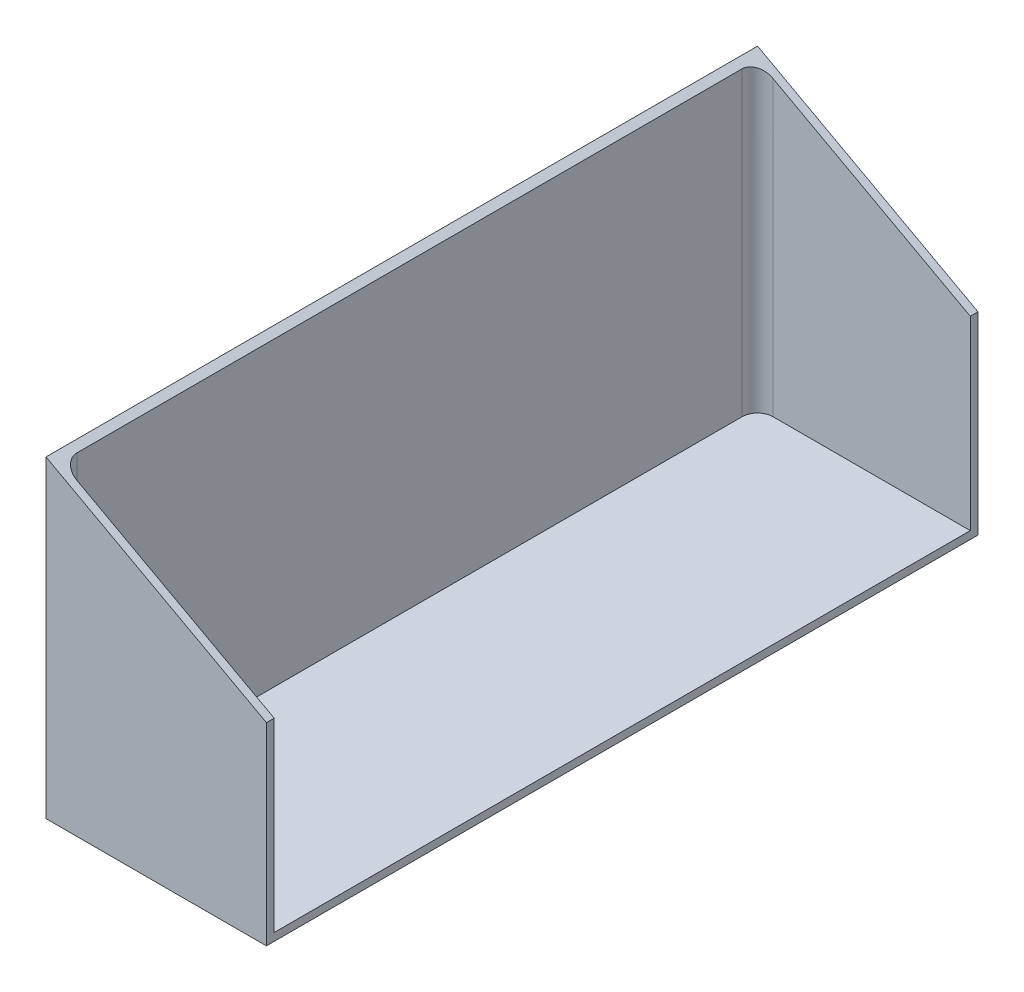
ISO-10303-21;
HEADER;
FILE_DESCRIPTION(('STEP AP214'),'2;1');
FILE_NAME('part.step','',(''),(''),'','','');
FILE_SCHEMA(('AUTOMOTIVE_DESIGN { 1 0 10303 214 1 1 1 1 }'));
ENDSEC;
DATA;
#1=APPLICATION_CONTEXT('core data for automotive mechanical design processes');
#2=APPLICATION_PROTOCOL_DEFINITION('international standard','automotive_design',2000,#1);
#3=PRODUCT_CONTEXT('',#1,'mechanical');
#4=PRODUCT('Part','Part','',(#3));
#5=PRODUCT_RELATED_PRODUCT_CATEGORY('part','',(#4));
#6=PRODUCT_DEFINITION_FORMATION('','',#4);
#7=PRODUCT_DEFINITION_CONTEXT('part definition',#1,'design');
#8=PRODUCT_DEFINITION('design','',#6,#7);
#9=PRODUCT_DEFINITION_SHAPE('','',#8);
#10=(LENGTH_UNIT() NAMED_UNIT(*) SI_UNIT(.MILLI.,.METRE.));
#11=(NAMED_UNIT(*) PLANE_ANGLE_UNIT() SI_UNIT($,.RADIAN.));
#12=(NAMED_UNIT(*) SI_UNIT($,.STERADIAN.) SOLID_ANGLE_UNIT());
#13=UNCERTAINTY_MEASURE_WITH_UNIT(LENGTH_MEASURE(1.E-05),#10,'distance_accuracy_value','');
#14=(GEOMETRIC_REPRESENTATION_CONTEXT(3) GLOBAL_UNCERTAINTY_ASSIGNED_CONTEXT((#13)) GLOBAL_UNIT_ASSIGNED_CONTEXT((#10,
#11,#12)) REPRESENTATION_CONTEXT('',''));
#15=CARTESIAN_POINT('',(0.,0.,0.));
#16=DIRECTION('',(0.,0.,1.));
#17=DIRECTION('',(1.,0.,0.));
#18=AXIS2_PLACEMENT_3D('',#15,#16,#17);
#19=CARTESIAN_POINT('',(0.,0.,-10.));
#20=DIRECTION('',(-1.,0.,0.));
#21=DIRECTION('',(0.,0.,1.));
#22=AXIS2_PLACEMENT_3D('',#19,#20,#21);
#23=PLANE('',#22);
#24=DIRECTION('',(0.,-1.,0.));
#25=VECTOR('',#24,1.);
#26=CARTESIAN_POINT('',(0.,0.,0.));
#27=LINE('',#26,#25);
#28=CARTESIAN_POINT('',(0.,405.,0.));
#29=VERTEX_POINT('',#28);
#30=CARTESIAN_POINT('',(0.,0.,0.));
#31=VERTEX_POINT('',#30);
#32=EDGE_CURVE('E160',#29,#31,#27,.T.);
#33=ORIENTED_EDGE('',*,*,#32,.F.);
#34=DIRECTION('',(0.,0.,1.));
#35=VECTOR('',#34,1.);
#36=CARTESIAN_POINT('',(0.,405.,-10.));
#37=LINE('',#36,#35);
#38=CARTESIAN_POINT('',(0.,405.,-920.));
#39=VERTEX_POINT('',#38);
#40=EDGE_CURVE('E175',#39,#29,#37,.T.);
#41=ORIENTED_EDGE('',*,*,#40,.F.);
#42=DIRECTION('',(0.,-1.,0.));
#43=VECTOR('',#42,1.);
#44=CARTESIAN_POINT('',(0.,0.,-920.));
#45=LINE('',#44,#43);
#46=CARTESIAN_POINT('',(0.,0.,-920.));
#47=VERTEX_POINT('',#46);
#48=EDGE_CURVE('E144',#39,#47,#45,.T.);
#49=ORIENTED_EDGE('',*,*,#48,.T.);
#50=DIRECTION('',(0.,0.,1.));
#51=VECTOR('',#50,1.);
#52=CARTESIAN_POINT('',(0.,0.,-10.));
#53=LINE('',#52,#51);
#54=EDGE_CURVE('E166',#47,#31,#53,.T.);
#55=ORIENTED_EDGE('',*,*,#54,.T.);
#56=EDGE_LOOP('',(#33,#41,#49,#55));
#57=FACE_BOUND('',#56,.T.);
#58=ADVANCED_FACE('F38',(#57),#23,.T.);
#59=CARTESIAN_POINT('',(0.,405.,-10.));
#60=DIRECTION('',(0.477771946909984,0.878483902382874,0.));
#61=DIRECTION('',(-0.878483902382874,0.477771946909984,0.));
#62=AXIS2_PLACEMENT_3D('',#59,#60,#61);
#63=PLANE('',#62);
#64=DIRECTION('',(-0.878483902382874,0.477771946909984,0.));
#65=VECTOR('',#64,1.);
#66=CARTESIAN_POINT('',(0.,405.,-10.));
#67=LINE('',#66,#65);
#68=CARTESIAN_POINT('',(285.,250.,-10.));
#69=VERTEX_POINT('',#68);
#70=CARTESIAN_POINT('',(30.,388.684210526316,-10.));
#71=VERTEX_POINT('',#70);
#72=EDGE_CURVE('E163',#69,#71,#67,.T.);
#73=ORIENTED_EDGE('',*,*,#72,.T.);
#74=CARTESIAN_POINT('',(30.,388.684210526316,-30.));
#75=DIRECTION('',(0.477771946909984,0.878483902382874,0.));
#76=DIRECTION('',(-0.878483902382874,0.477771946909984,0.));
#77=AXIS2_PLACEMENT_3D('',#74,#75,#76);
#78=ELLIPSE('',#77,22.7664957158012,20.);
#79=CARTESIAN_POINT('',(10.,399.561403508772,-30.0000000000002));
#80=VERTEX_POINT('',#79);
#81=EDGE_CURVE('E11',#71,#80,#78,.F.);
#82=ORIENTED_EDGE('',*,*,#81,.T.);
#83=DIRECTION('',(0.,0.,1.));
#84=VECTOR('',#83,1.);
#85=CARTESIAN_POINT('',(10.,399.561403508772,-910.));
#86=LINE('',#85,#84);
#87=CARTESIAN_POINT('',(10.,399.561403508772,-890.));
#88=VERTEX_POINT('',#87);
#89=EDGE_CURVE('E155',#88,#80,#86,.T.);
#90=ORIENTED_EDGE('',*,*,#89,.F.);
#91=CARTESIAN_POINT('',(30.,388.684210526316,-890.));
#92=DIRECTION('',(0.477771946909984,0.878483902382874,0.));
#93=DIRECTION('',(0.878483902382874,-0.477771946909984,0.));
#94=AXIS2_PLACEMENT_3D('',#91,#92,#93);
#95=ELLIPSE('',#94,22.7664957158012,20.);
#96=CARTESIAN_POINT('',(30.,388.684210526316,-910.));
#97=VERTEX_POINT('',#96);
#98=EDGE_CURVE('E46',#88,#97,#95,.F.);
#99=ORIENTED_EDGE('',*,*,#98,.T.);
#100=DIRECTION('',(-0.878483902382874,0.477771946909984,0.));
#101=VECTOR('',#100,1.);
#102=CARTESIAN_POINT('',(0.,405.,-910.));
#103=LINE('',#102,#101);
#104=CARTESIAN_POINT('',(285.,250.,-910.));
#105=VERTEX_POINT('',#104);
#106=EDGE_CURVE('E119',#105,#97,#103,.T.);
#107=ORIENTED_EDGE('',*,*,#106,.F.);
#108=DIRECTION('',(0.,0.,-1.));
#109=VECTOR('',#108,1.);
#110=CARTESIAN_POINT('',(285.,250.,-910.));
#111=LINE('',#110,#109);
#112=CARTESIAN_POINT('',(285.,250.,-920.));
#113=VERTEX_POINT('',#112);
#114=EDGE_CURVE('E126',#105,#113,#111,.T.);
#115=ORIENTED_EDGE('',*,*,#114,.T.);
#116=DIRECTION('',(-0.878483902382874,0.477771946909984,0.));
#117=VECTOR('',#116,1.);
#118=CARTESIAN_POINT('',(0.,405.,-920.));
#119=LINE('',#118,#117);
#120=EDGE_CURVE('E147',#113,#39,#119,.T.);
#121=ORIENTED_EDGE('',*,*,#120,.T.);
#122=ORIENTED_EDGE('',*,*,#40,.T.);
#123=DIRECTION('',(-0.878483902382874,0.477771946909984,0.));
#124=VECTOR('',#123,1.);
#125=CARTESIAN_POINT('',(0.,405.,0.));
#126=LINE('',#125,#124);
#127=CARTESIAN_POINT('',(285.,250.,0.));
#128=VERTEX_POINT('',#127);
#129=EDGE_CURVE('E164',#128,#29,#126,.T.);
#130=ORIENTED_EDGE('',*,*,#129,.F.);
#131=DIRECTION('',(0.,0.,1.));
#132=VECTOR('',#131,1.);
#133=CARTESIAN_POINT('',(285.,250.,-10.));
#134=LINE('',#133,#132);
#135=EDGE_CURVE('E179',#69,#128,#134,.T.);
#136=ORIENTED_EDGE('',*,*,#135,.F.);
#137=EDGE_LOOP('',(#73,#82,#90,#99,#107,#115,#121,#122,#130,#136));
#138=FACE_BOUND('',#137,.T.);
#139=ADVANCED_FACE('F137',(#138),#63,.T.);
#140=CARTESIAN_POINT('',(285.,0.,-10.));
#141=DIRECTION('',(1.,0.,0.));
#142=DIRECTION('',(0.,0.,-1.));
#143=AXIS2_PLACEMENT_3D('',#140,#141,#142);
#144=PLANE('',#143);
#145=ORIENTED_EDGE('',*,*,#135,.T.);
#146=DIRECTION('',(0.,1.,0.));
#147=VECTOR('',#146,1.);
#148=CARTESIAN_POINT('',(285.,0.,0.));
#149=LINE('',#148,#147);
#150=CARTESIAN_POINT('',(285.,0.,0.));
#151=VERTEX_POINT('',#150);
#152=EDGE_CURVE('E172',#151,#128,#149,.T.);
#153=ORIENTED_EDGE('',*,*,#152,.F.);
#154=DIRECTION('',(0.,0.,1.));
#155=VECTOR('',#154,1.);
#156=CARTESIAN_POINT('',(285.,0.,-10.));
#157=LINE('',#156,#155);
#158=CARTESIAN_POINT('',(285.,0.,-920.));
#159=VERTEX_POINT('',#158);
#160=EDGE_CURVE('E181',#159,#151,#157,.T.);
#161=ORIENTED_EDGE('',*,*,#160,.F.);
#162=DIRECTION('',(0.,1.,0.));
#163=VECTOR('',#162,1.);
#164=CARTESIAN_POINT('',(285.,0.,-920.));
#165=LINE('',#164,#163);
#166=EDGE_CURVE('E132',#159,#113,#165,.T.);
#167=ORIENTED_EDGE('',*,*,#166,.T.);
#168=ORIENTED_EDGE('',*,*,#114,.F.);
#169=DIRECTION('',(0.,1.,0.));
#170=VECTOR('',#169,1.);
#171=CARTESIAN_POINT('',(285.,0.,-910.));
#172=LINE('',#171,#170);
#173=CARTESIAN_POINT('',(285.,9.99999999999998,-910.));
#174=VERTEX_POINT('',#173);
#175=EDGE_CURVE('E115',#174,#105,#172,.T.);
#176=ORIENTED_EDGE('',*,*,#175,.F.);
#177=DIRECTION('',(0.,0.,1.));
#178=VECTOR('',#177,1.);
#179=CARTESIAN_POINT('',(285.,10.,-910.));
#180=LINE('',#179,#178);
#181=CARTESIAN_POINT('',(285.,10.,-10.));
#182=VERTEX_POINT('',#181);
#183=EDGE_CURVE('E152',#174,#182,#180,.T.);
#184=ORIENTED_EDGE('',*,*,#183,.T.);
#185=DIRECTION('',(0.,1.,0.));
#186=VECTOR('',#185,1.);
#187=CARTESIAN_POINT('',(285.,0.,-10.));
#188=LINE('',#187,#186);
#189=EDGE_CURVE('E161',#182,#69,#188,.T.);
#190=ORIENTED_EDGE('',*,*,#189,.T.);
#191=EDGE_LOOP('',(#145,#153,#161,#167,#168,#176,#184,#190));
#192=FACE_BOUND('',#191,.T.);
#193=ADVANCED_FACE('F130',(#192),#144,.T.);
#194=CARTESIAN_POINT('',(0.,0.,-10.));
#195=DIRECTION('',(0.,-1.,0.));
#196=DIRECTION('',(0.,0.,-1.));
#197=AXIS2_PLACEMENT_3D('',#194,#195,#196);
#198=PLANE('',#197);
#199=DIRECTION('',(1.,0.,0.));
#200=VECTOR('',#199,1.);
#201=CARTESIAN_POINT('',(0.,0.,0.));
#202=LINE('',#201,#200);
#203=EDGE_CURVE('E169',#31,#151,#202,.T.);
#204=ORIENTED_EDGE('',*,*,#203,.F.);
#205=ORIENTED_EDGE('',*,*,#54,.F.);
#206=DIRECTION('',(1.,0.,0.));
#207=VECTOR('',#206,1.);
#208=CARTESIAN_POINT('',(0.,0.,-920.));
#209=LINE('',#208,#207);
#210=EDGE_CURVE('E139',#47,#159,#209,.T.);
#211=ORIENTED_EDGE('',*,*,#210,.T.);
#212=ORIENTED_EDGE('',*,*,#160,.T.);
#213=EDGE_LOOP('',(#204,#205,#211,#212));
#214=FACE_BOUND('',#213,.T.);
#215=ADVANCED_FACE('F221',(#214),#198,.T.);
#216=CARTESIAN_POINT('',(0.,0.,-10.));
#217=DIRECTION('',(0.,0.,-1.));
#218=DIRECTION('',(-1.,0.,0.));
#219=AXIS2_PLACEMENT_3D('',#216,#217,#218);
#220=PLANE('',#219);
#221=DIRECTION('',(1.,0.,0.));
#222=VECTOR('',#221,1.);
#223=CARTESIAN_POINT('',(0.,9.99999999999995,-10.));
#224=LINE('',#223,#222);
#225=CARTESIAN_POINT('',(30.,9.99999999999996,-10.));
#226=VERTEX_POINT('',#225);
#227=EDGE_CURVE('E154',#226,#182,#224,.T.);
#228=ORIENTED_EDGE('',*,*,#227,.F.);
#229=DIRECTION('',(0.,-1.,0.));
#230=VECTOR('',#229,1.);
#231=CARTESIAN_POINT('',(30.,399.561403508772,-10.));
#232=LINE('',#231,#230);
#233=EDGE_CURVE('E53',#226,#71,#232,.F.);
#234=ORIENTED_EDGE('',*,*,#233,.T.);
#235=ORIENTED_EDGE('',*,*,#72,.F.);
#236=ORIENTED_EDGE('',*,*,#189,.F.);
#237=EDGE_LOOP('',(#228,#234,#235,#236));
#238=FACE_BOUND('',#237,.T.);
#239=ADVANCED_FACE('F224',(#238),#220,.T.);
#240=CARTESIAN_POINT('',(0.,0.,0.));
#241=DIRECTION('',(0.,0.,-1.));
#242=DIRECTION('',(-1.,0.,0.));
#243=AXIS2_PLACEMENT_3D('',#240,#241,#242);
#244=PLANE('',#243);
#245=ORIENTED_EDGE('',*,*,#152,.T.);
#246=ORIENTED_EDGE('',*,*,#129,.T.);
#247=ORIENTED_EDGE('',*,*,#32,.T.);
#248=ORIENTED_EDGE('',*,*,#203,.T.);
#249=EDGE_LOOP('',(#245,#246,#247,#248));
#250=FACE_BOUND('',#249,.T.);
#251=ADVANCED_FACE('F228',(#250),#244,.F.);
#252=CARTESIAN_POINT('',(0.,9.99999999999995,-910.));
#253=DIRECTION('',(0.,1.,0.));
#254=DIRECTION('',(-1.,0.,0.));
#255=AXIS2_PLACEMENT_3D('',#252,#253,#254);
#256=PLANE('',#255);
#257=DIRECTION('',(-1.,0.,0.));
#258=VECTOR('',#257,1.);
#259=CARTESIAN_POINT('',(0.,9.99999999999995,-910.));
#260=LINE('',#259,#258);
#261=CARTESIAN_POINT('',(30.,9.99999999999996,-910.));
#262=VERTEX_POINT('',#261);
#263=EDGE_CURVE('E122',#174,#262,#260,.T.);
#264=ORIENTED_EDGE('',*,*,#263,.T.);
#265=CARTESIAN_POINT('',(30.,9.99999999999996,-890.));
#266=DIRECTION('',(0.,1.,0.));
#267=DIRECTION('',(-1.,0.,0.));
#268=AXIS2_PLACEMENT_3D('',#265,#266,#267);
#269=CIRCLE('',#268,20.);
#270=CARTESIAN_POINT('',(9.99999999999998,9.99999999999995,-890.));
#271=VERTEX_POINT('',#270);
#272=EDGE_CURVE('E192',#262,#271,#269,.T.);
#273=ORIENTED_EDGE('',*,*,#272,.T.);
#274=DIRECTION('',(0.,0.,1.));
#275=VECTOR('',#274,1.);
#276=CARTESIAN_POINT('',(9.99999999999998,9.99999999999995,-910.));
#277=LINE('',#276,#275);
#278=CARTESIAN_POINT('',(9.99999999999998,9.99999999999995,-30.0000000000002));
#279=VERTEX_POINT('',#278);
#280=EDGE_CURVE('E151',#271,#279,#277,.T.);
#281=ORIENTED_EDGE('',*,*,#280,.T.);
#282=CARTESIAN_POINT('',(30.,9.99999999999996,-30.));
#283=DIRECTION('',(0.,1.,0.));
#284=DIRECTION('',(-1.,0.,0.));
#285=AXIS2_PLACEMENT_3D('',#282,#283,#284);
#286=CIRCLE('',#285,20.);
#287=EDGE_CURVE('E61',#279,#226,#286,.T.);
#288=ORIENTED_EDGE('',*,*,#287,.T.);
#289=ORIENTED_EDGE('',*,*,#227,.T.);
#290=ORIENTED_EDGE('',*,*,#183,.F.);
#291=EDGE_LOOP('',(#264,#273,#281,#288,#289,#290));
#292=FACE_BOUND('',#291,.T.);
#293=ADVANCED_FACE('F196',(#292),#256,.T.);
#294=CARTESIAN_POINT('',(9.99999999999998,0.,-910.));
#295=DIRECTION('',(1.,0.,0.));
#296=DIRECTION('',(0.,1.,0.));
#297=AXIS2_PLACEMENT_3D('',#294,#295,#296);
#298=PLANE('',#297);
#299=ORIENTED_EDGE('',*,*,#280,.F.);
#300=DIRECTION('',(0.,1.,0.));
#301=VECTOR('',#300,1.);
#302=CARTESIAN_POINT('',(10.,399.561403508772,-890.));
#303=LINE('',#302,#301);
#304=EDGE_CURVE('E186',#271,#88,#303,.T.);
#305=ORIENTED_EDGE('',*,*,#304,.T.);
#306=ORIENTED_EDGE('',*,*,#89,.T.);
#307=DIRECTION('',(0.,-1.,0.));
#308=VECTOR('',#307,1.);
#309=CARTESIAN_POINT('',(9.99999999999998,9.99999999999995,-30.));
#310=LINE('',#309,#308);
#311=EDGE_CURVE('E178',#80,#279,#310,.T.);
#312=ORIENTED_EDGE('',*,*,#311,.T.);
#313=EDGE_LOOP('',(#299,#305,#306,#312));
#314=FACE_BOUND('',#313,.T.);
#315=ADVANCED_FACE('F200',(#314),#298,.T.);
#316=CARTESIAN_POINT('',(0.,0.,-910.));
#317=DIRECTION('',(0.,0.,1.));
#318=DIRECTION('',(-1.,0.,0.));
#319=AXIS2_PLACEMENT_3D('',#316,#317,#318);
#320=PLANE('',#319);
#321=ORIENTED_EDGE('',*,*,#106,.T.);
#322=DIRECTION('',(0.,1.,0.));
#323=VECTOR('',#322,1.);
#324=CARTESIAN_POINT('',(30.,9.99999999999995,-910.));
#325=LINE('',#324,#323);
#326=EDGE_CURVE('E189',#97,#262,#325,.F.);
#327=ORIENTED_EDGE('',*,*,#326,.T.);
#328=ORIENTED_EDGE('',*,*,#263,.F.);
#329=ORIENTED_EDGE('',*,*,#175,.T.);
#330=EDGE_LOOP('',(#321,#327,#328,#329));
#331=FACE_BOUND('',#330,.T.);
#332=ADVANCED_FACE('F117',(#331),#320,.T.);
#333=CARTESIAN_POINT('',(0.,0.,-920.));
#334=DIRECTION('',(0.,0.,1.));
#335=DIRECTION('',(-1.,0.,0.));
#336=AXIS2_PLACEMENT_3D('',#333,#334,#335);
#337=PLANE('',#336);
#338=ORIENTED_EDGE('',*,*,#48,.F.);
#339=ORIENTED_EDGE('',*,*,#120,.F.);
#340=ORIENTED_EDGE('',*,*,#166,.F.);
#341=ORIENTED_EDGE('',*,*,#210,.F.);
#342=EDGE_LOOP('',(#338,#339,#340,#341));
#343=FACE_BOUND('',#342,.T.);
#344=ADVANCED_FACE('F204',(#343),#337,.F.);
#345=CARTESIAN_POINT('',(30.,0.,-890.));
#346=DIRECTION('',(0.,-1.,0.));
#347=DIRECTION('',(1.,0.,0.));
#348=AXIS2_PLACEMENT_3D('',#345,#346,#347);
#349=CYLINDRICAL_SURFACE('',#348,20.);
#350=ORIENTED_EDGE('',*,*,#272,.F.);
#351=ORIENTED_EDGE('',*,*,#326,.F.);
#352=ORIENTED_EDGE('',*,*,#98,.F.);
#353=ORIENTED_EDGE('',*,*,#304,.F.);
#354=EDGE_LOOP('',(#350,#351,#352,#353));
#355=FACE_BOUND('',#354,.T.);
#356=ADVANCED_FACE('F202',(#355),#349,.F.);
#357=CARTESIAN_POINT('',(30.,0.,-30.));
#358=DIRECTION('',(0.,1.,0.));
#359=DIRECTION('',(-1.,0.,0.));
#360=AXIS2_PLACEMENT_3D('',#357,#358,#359);
#361=CYLINDRICAL_SURFACE('',#360,20.);
#362=ORIENTED_EDGE('',*,*,#81,.F.);
#363=ORIENTED_EDGE('',*,*,#233,.F.);
#364=ORIENTED_EDGE('',*,*,#287,.F.);
#365=ORIENTED_EDGE('',*,*,#311,.F.);
#366=EDGE_LOOP('',(#362,#363,#364,#365));
#367=FACE_BOUND('',#366,.T.);
#368=ADVANCED_FACE('F40',(#367),#361,.F.);
#369=CLOSED_SHELL('',(#58,#139,#193,#215,#239,#251,#293,#315,#332,#344,#356,#368));
#370=MANIFOLD_SOLID_BREP('B2',#369);
#371=ADVANCED_BREP_SHAPE_REPRESENTATION('',(#18,#370),#14);
#372=SHAPE_DEFINITION_REPRESENTATION(#9,#371);
ENDSEC;
END-ISO-10303-21;
